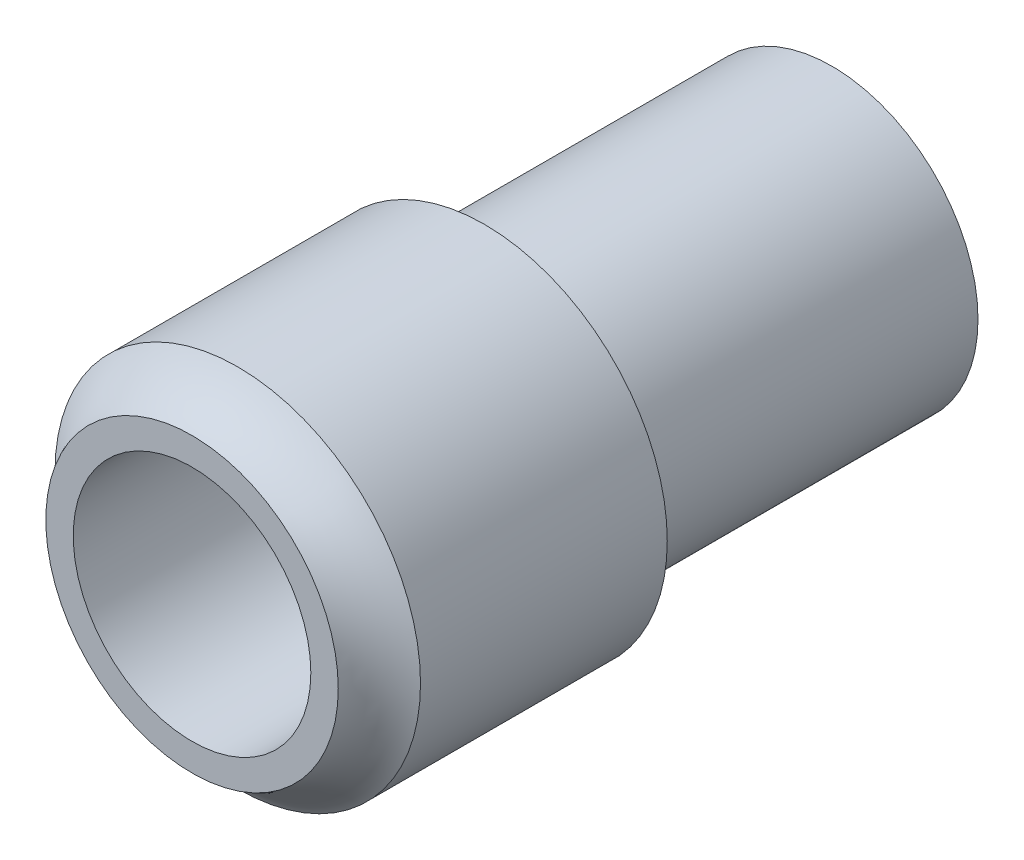
ISO-10303-21;
HEADER;
FILE_DESCRIPTION(('STEP AP214'),'2;1');
FILE_NAME('part.step','',(''),(''),'','','');
FILE_SCHEMA(('AUTOMOTIVE_DESIGN { 1 0 10303 214 1 1 1 1 }'));
ENDSEC;
DATA;
#1=APPLICATION_CONTEXT('core data for automotive mechanical design processes');
#2=APPLICATION_PROTOCOL_DEFINITION('international standard','automotive_design',2000,#1);
#3=PRODUCT_CONTEXT('',#1,'mechanical');
#4=PRODUCT('Part','Part','',(#3));
#5=PRODUCT_RELATED_PRODUCT_CATEGORY('part','',(#4));
#6=PRODUCT_DEFINITION_FORMATION('','',#4);
#7=PRODUCT_DEFINITION_CONTEXT('part definition',#1,'design');
#8=PRODUCT_DEFINITION('design','',#6,#7);
#9=PRODUCT_DEFINITION_SHAPE('','',#8);
#10=(LENGTH_UNIT() NAMED_UNIT(*) SI_UNIT(.MILLI.,.METRE.));
#11=(NAMED_UNIT(*) PLANE_ANGLE_UNIT() SI_UNIT($,.RADIAN.));
#12=(NAMED_UNIT(*) SI_UNIT($,.STERADIAN.) SOLID_ANGLE_UNIT());
#13=UNCERTAINTY_MEASURE_WITH_UNIT(LENGTH_MEASURE(1.E-05),#10,'distance_accuracy_value','');
#14=(GEOMETRIC_REPRESENTATION_CONTEXT(3) GLOBAL_UNCERTAINTY_ASSIGNED_CONTEXT((#13)) GLOBAL_UNIT_ASSIGNED_CONTEXT((#10,
#11,#12)) REPRESENTATION_CONTEXT('',''));
#15=CARTESIAN_POINT('',(0.,0.,0.));
#16=DIRECTION('',(0.,0.,1.));
#17=DIRECTION('',(1.,0.,0.));
#18=AXIS2_PLACEMENT_3D('',#15,#16,#17);
#19=CARTESIAN_POINT('',(0.,0.,16.));
#20=DIRECTION('',(0.,0.,1.));
#21=DIRECTION('',(1.,0.,0.));
#22=AXIS2_PLACEMENT_3D('',#19,#20,#21);
#23=CYLINDRICAL_SURFACE('',#22,8.);
#24=CARTESIAN_POINT('',(0.,0.,0.));
#25=DIRECTION('',(0.,0.,1.));
#26=DIRECTION('',(1.,0.,0.));
#27=AXIS2_PLACEMENT_3D('',#24,#25,#26);
#28=CIRCLE('',#27,8.);
#29=CARTESIAN_POINT('',(8.,0.,0.));
#30=VERTEX_POINT('',#29);
#31=EDGE_CURVE('E57',#30,#30,#28,.T.);
#32=ORIENTED_EDGE('',*,*,#31,.F.);
#33=EDGE_LOOP('',(#32));
#34=FACE_BOUND('',#33,.T.);
#35=CARTESIAN_POINT('',(0.,0.,-19.));
#36=DIRECTION('',(0.,0.,1.));
#37=DIRECTION('',(1.,0.,0.));
#38=AXIS2_PLACEMENT_3D('',#35,#36,#37);
#39=CIRCLE('',#38,8.);
#40=CARTESIAN_POINT('',(8.,0.,-19.));
#41=VERTEX_POINT('',#40);
#42=EDGE_CURVE('E10',#41,#41,#39,.T.);
#43=ORIENTED_EDGE('',*,*,#42,.T.);
#44=EDGE_LOOP('',(#43));
#45=FACE_BOUND('',#44,.T.);
#46=ADVANCED_FACE('F38',(#34,#45),#23,.T.);
#47=CARTESIAN_POINT('',(0.,0.,-19.));
#48=DIRECTION('',(0.,0.,1.));
#49=DIRECTION('',(1.,0.,0.));
#50=AXIS2_PLACEMENT_3D('',#47,#48,#49);
#51=PLANE('',#50);
#52=CARTESIAN_POINT('',(0.,0.,-19.));
#53=DIRECTION('',(0.,0.,1.));
#54=DIRECTION('',(1.,0.,0.));
#55=AXIS2_PLACEMENT_3D('',#52,#53,#54);
#56=CIRCLE('',#55,6.5);
#57=CARTESIAN_POINT('',(6.5,0.,-19.));
#58=VERTEX_POINT('',#57);
#59=EDGE_CURVE('E60',#58,#58,#56,.T.);
#60=ORIENTED_EDGE('',*,*,#59,.T.);
#61=EDGE_LOOP('',(#60));
#62=FACE_BOUND('',#61,.T.);
#63=ORIENTED_EDGE('',*,*,#42,.F.);
#64=EDGE_LOOP('',(#63));
#65=FACE_BOUND('',#64,.T.);
#66=ADVANCED_FACE('F67',(#62,#65),#51,.F.);
#67=CARTESIAN_POINT('',(0.,8.,16.));
#68=DIRECTION('',(0.,0.,-1.));
#69=DIRECTION('',(-1.,0.,0.));
#70=AXIS2_PLACEMENT_3D('',#67,#68,#69);
#71=PLANE('',#70);
#72=CARTESIAN_POINT('',(0.,0.,16.));
#73=DIRECTION('',(0.,0.,1.));
#74=DIRECTION('',(1.,0.,0.));
#75=AXIS2_PLACEMENT_3D('',#72,#73,#74);
#76=CIRCLE('',#75,6.5);
#77=CARTESIAN_POINT('',(6.5,0.,16.));
#78=VERTEX_POINT('',#77);
#79=EDGE_CURVE('E61',#78,#78,#76,.T.);
#80=ORIENTED_EDGE('',*,*,#79,.F.);
#81=EDGE_LOOP('',(#80));
#82=FACE_BOUND('',#81,.T.);
#83=CARTESIAN_POINT('',(0.,0.,16.));
#84=DIRECTION('',(0.,0.,1.));
#85=DIRECTION('',(1.,0.,0.));
#86=AXIS2_PLACEMENT_3D('',#83,#84,#85);
#87=CIRCLE('',#86,8.);
#88=CARTESIAN_POINT('',(8.,0.,16.));
#89=VERTEX_POINT('',#88);
#90=EDGE_CURVE('E44',#89,#89,#87,.T.);
#91=ORIENTED_EDGE('',*,*,#90,.T.);
#92=EDGE_LOOP('',(#91));
#93=FACE_BOUND('',#92,.T.);
#94=ADVANCED_FACE('F77',(#82,#93),#71,.F.);
#95=CARTESIAN_POINT('',(0.,0.,17.7090703879725));
#96=DIRECTION('',(0.,0.,1.));
#97=DIRECTION('',(1.,0.,0.));
#98=AXIS2_PLACEMENT_3D('',#95,#96,#97);
#99=TOROIDAL_SURFACE('',#98,12.6988379849656,5.);
#100=ORIENTED_EDGE('',*,*,#90,.F.);
#101=EDGE_LOOP('',(#100));
#102=FACE_BOUND('',#101,.T.);
#103=CARTESIAN_POINT('',(0.,0.,13.5));
#104=DIRECTION('',(0.,0.,1.));
#105=DIRECTION('',(1.,0.,0.));
#106=AXIS2_PLACEMENT_3D('',#103,#104,#105);
#107=CIRCLE('',#106,10.);
#108=CARTESIAN_POINT('',(10.,0.,13.5));
#109=VERTEX_POINT('',#108);
#110=EDGE_CURVE('E48',#109,#109,#107,.T.);
#111=ORIENTED_EDGE('',*,*,#110,.T.);
#112=EDGE_LOOP('',(#111));
#113=FACE_BOUND('',#112,.T.);
#114=ADVANCED_FACE('F79',(#102,#113),#99,.F.);
#115=CARTESIAN_POINT('',(0.,0.,16.));
#116=DIRECTION('',(0.,0.,1.));
#117=DIRECTION('',(1.,0.,0.));
#118=AXIS2_PLACEMENT_3D('',#115,#116,#117);
#119=CYLINDRICAL_SURFACE('',#118,10.);
#120=ORIENTED_EDGE('',*,*,#110,.F.);
#121=EDGE_LOOP('',(#120));
#122=FACE_BOUND('',#121,.T.);
#123=CARTESIAN_POINT('',(0.,0.,0.));
#124=DIRECTION('',(0.,0.,1.));
#125=DIRECTION('',(1.,0.,0.));
#126=AXIS2_PLACEMENT_3D('',#123,#124,#125);
#127=CIRCLE('',#126,10.);
#128=CARTESIAN_POINT('',(10.,0.,0.));
#129=VERTEX_POINT('',#128);
#130=EDGE_CURVE('E52',#129,#129,#127,.T.);
#131=ORIENTED_EDGE('',*,*,#130,.T.);
#132=EDGE_LOOP('',(#131));
#133=FACE_BOUND('',#132,.T.);
#134=ADVANCED_FACE('F85',(#122,#133),#119,.T.);
#135=CARTESIAN_POINT('',(0.,8.,0.));
#136=DIRECTION('',(0.,0.,1.));
#137=DIRECTION('',(1.,0.,0.));
#138=AXIS2_PLACEMENT_3D('',#135,#136,#137);
#139=PLANE('',#138);
#140=ORIENTED_EDGE('',*,*,#130,.F.);
#141=EDGE_LOOP('',(#140));
#142=FACE_BOUND('',#141,.T.);
#143=ORIENTED_EDGE('',*,*,#31,.T.);
#144=EDGE_LOOP('',(#143));
#145=FACE_BOUND('',#144,.T.);
#146=ADVANCED_FACE('F73',(#142,#145),#139,.F.);
#147=CARTESIAN_POINT('',(0.,0.,-19.));
#148=DIRECTION('',(0.,0.,1.));
#149=DIRECTION('',(1.,0.,0.));
#150=AXIS2_PLACEMENT_3D('',#147,#148,#149);
#151=CYLINDRICAL_SURFACE('',#150,6.5);
#152=ORIENTED_EDGE('',*,*,#59,.F.);
#153=EDGE_LOOP('',(#152));
#154=FACE_BOUND('',#153,.T.);
#155=ORIENTED_EDGE('',*,*,#79,.T.);
#156=EDGE_LOOP('',(#155));
#157=FACE_BOUND('',#156,.T.);
#158=ADVANCED_FACE('F70',(#154,#157),#151,.F.);
#159=CLOSED_SHELL('',(#46,#66,#94,#114,#134,#146,#158));
#160=MANIFOLD_SOLID_BREP('B2',#159);
#161=ADVANCED_BREP_SHAPE_REPRESENTATION('',(#18,#160),#14);
#162=SHAPE_DEFINITION_REPRESENTATION(#9,#161);
ENDSEC;
END-ISO-10303-21;
